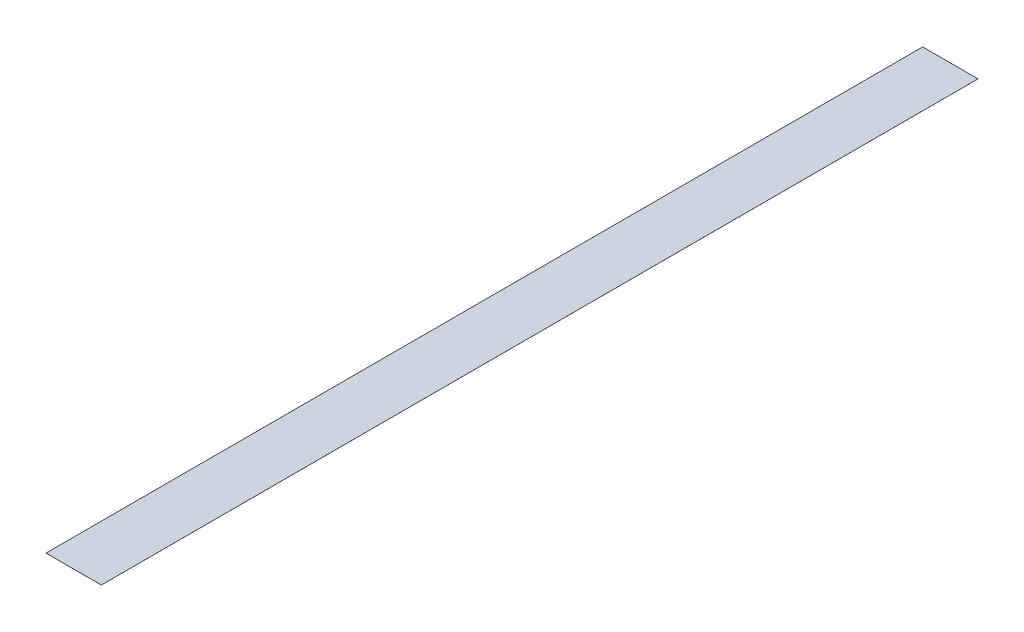
ISO-10303-21;
HEADER;
FILE_DESCRIPTION(('STEP AP214'),'2;1');
FILE_NAME('part.step','',(''),(''),'','','');
FILE_SCHEMA(('AUTOMOTIVE_DESIGN { 1 0 10303 214 1 1 1 1 }'));
ENDSEC;
DATA;
#1=APPLICATION_CONTEXT('core data for automotive mechanical design processes');
#2=APPLICATION_PROTOCOL_DEFINITION('international standard','automotive_design',2000,#1);
#3=PRODUCT_CONTEXT('',#1,'mechanical');
#4=PRODUCT('Part','Part','',(#3));
#5=PRODUCT_RELATED_PRODUCT_CATEGORY('part','',(#4));
#6=PRODUCT_DEFINITION_FORMATION('','',#4);
#7=PRODUCT_DEFINITION_CONTEXT('part definition',#1,'design');
#8=PRODUCT_DEFINITION('design','',#6,#7);
#9=PRODUCT_DEFINITION_SHAPE('','',#8);
#10=(LENGTH_UNIT() NAMED_UNIT(*) SI_UNIT(.MILLI.,.METRE.));
#11=(NAMED_UNIT(*) PLANE_ANGLE_UNIT() SI_UNIT($,.RADIAN.));
#12=(NAMED_UNIT(*) SI_UNIT($,.STERADIAN.) SOLID_ANGLE_UNIT());
#13=UNCERTAINTY_MEASURE_WITH_UNIT(LENGTH_MEASURE(1.E-05),#10,'distance_accuracy_value','');
#14=(GEOMETRIC_REPRESENTATION_CONTEXT(3) GLOBAL_UNCERTAINTY_ASSIGNED_CONTEXT((#13)) GLOBAL_UNIT_ASSIGNED_CONTEXT((#10,
#11,#12)) REPRESENTATION_CONTEXT('',''));
#15=CARTESIAN_POINT('',(0.,0.,0.));
#16=DIRECTION('',(0.,0.,1.));
#17=DIRECTION('',(1.,0.,0.));
#18=AXIS2_PLACEMENT_3D('',#15,#16,#17);
#19=CARTESIAN_POINT('',(558.780538831302,0.01,-1049.27255795052));
#20=DIRECTION('',(0.,0.,-1.));
#21=DIRECTION('',(-1.,0.,0.));
#22=AXIS2_PLACEMENT_3D('',#19,#20,#21);
#23=PLANE('',#22);
#24=DIRECTION('',(1.,0.,0.));
#25=VECTOR('',#24,1.);
#26=CARTESIAN_POINT('',(558.780538831302,0.,-1049.27255795052));
#27=LINE('',#26,#25);
#28=CARTESIAN_POINT('',(558.780538831302,0.,-1049.27255795052));
#29=VERTEX_POINT('',#28);
#30=CARTESIAN_POINT('',(577.714930074055,0.,-1049.27255795052));
#31=VERTEX_POINT('',#30);
#32=EDGE_CURVE('E110',#29,#31,#27,.T.);
#33=ORIENTED_EDGE('',*,*,#32,.F.);
#34=DIRECTION('',(0.,-1.,0.));
#35=VECTOR('',#34,1.);
#36=CARTESIAN_POINT('',(558.780538831302,0.01,-1049.27255795052));
#37=LINE('',#36,#35);
#38=CARTESIAN_POINT('',(558.780538831302,0.01,-1049.27255795052));
#39=VERTEX_POINT('',#38);
#40=EDGE_CURVE('E11',#39,#29,#37,.T.);
#41=ORIENTED_EDGE('',*,*,#40,.F.);
#42=DIRECTION('',(1.,0.,0.));
#43=VECTOR('',#42,1.);
#44=CARTESIAN_POINT('',(558.780538831302,0.01,-1049.27255795052));
#45=LINE('',#44,#43);
#46=CARTESIAN_POINT('',(577.714930074055,0.01,-1049.27255795052));
#47=VERTEX_POINT('',#46);
#48=EDGE_CURVE('E103',#39,#47,#45,.T.);
#49=ORIENTED_EDGE('',*,*,#48,.T.);
#50=DIRECTION('',(0.,-1.,0.));
#51=VECTOR('',#50,1.);
#52=CARTESIAN_POINT('',(577.714930074055,0.01,-1049.27255795052));
#53=LINE('',#52,#51);
#54=EDGE_CURVE('E42',#47,#31,#53,.T.);
#55=ORIENTED_EDGE('',*,*,#54,.T.);
#56=EDGE_LOOP('',(#33,#41,#49,#55));
#57=FACE_BOUND('',#56,.T.);
#58=ADVANCED_FACE('F39',(#57),#23,.T.);
#59=CARTESIAN_POINT('',(558.780538831302,0.01,-1049.27255795052));
#60=DIRECTION('',(1.,0.,0.));
#61=DIRECTION('',(0.,0.,-1.));
#62=AXIS2_PLACEMENT_3D('',#59,#60,#61);
#63=PLANE('',#62);
#64=DIRECTION('',(0.,0.,1.));
#65=VECTOR('',#64,1.);
#66=CARTESIAN_POINT('',(558.780538831302,0.,-1049.27255795052));
#67=LINE('',#66,#65);
#68=CARTESIAN_POINT('',(558.780538831302,0.,-749.272557950517));
#69=VERTEX_POINT('',#68);
#70=EDGE_CURVE('E73',#29,#69,#67,.T.);
#71=ORIENTED_EDGE('',*,*,#70,.T.);
#72=DIRECTION('',(0.,-1.,0.));
#73=VECTOR('',#72,1.);
#74=CARTESIAN_POINT('',(558.780538831302,0.01,-749.272557950517));
#75=LINE('',#74,#73);
#76=CARTESIAN_POINT('',(558.780538831302,0.01,-749.272557950517));
#77=VERTEX_POINT('',#76);
#78=EDGE_CURVE('E49',#77,#69,#75,.T.);
#79=ORIENTED_EDGE('',*,*,#78,.F.);
#80=DIRECTION('',(0.,0.,1.));
#81=VECTOR('',#80,1.);
#82=CARTESIAN_POINT('',(558.780538831302,0.01,-1049.27255795052));
#83=LINE('',#82,#81);
#84=EDGE_CURVE('E90',#39,#77,#83,.T.);
#85=ORIENTED_EDGE('',*,*,#84,.F.);
#86=ORIENTED_EDGE('',*,*,#40,.T.);
#87=EDGE_LOOP('',(#71,#79,#85,#86));
#88=FACE_BOUND('',#87,.T.);
#89=ADVANCED_FACE('F126',(#88),#63,.F.);
#90=CARTESIAN_POINT('',(558.780538831302,0.01,-749.272557950517));
#91=DIRECTION('',(0.,0.,-1.));
#92=DIRECTION('',(-1.,0.,0.));
#93=AXIS2_PLACEMENT_3D('',#90,#91,#92);
#94=PLANE('',#93);
#95=DIRECTION('',(1.,0.,0.));
#96=VECTOR('',#95,1.);
#97=CARTESIAN_POINT('',(558.780538831302,0.,-749.272557950517));
#98=LINE('',#97,#96);
#99=CARTESIAN_POINT('',(577.714930074055,0.,-749.272557950517));
#100=VERTEX_POINT('',#99);
#101=EDGE_CURVE('E98',#69,#100,#98,.T.);
#102=ORIENTED_EDGE('',*,*,#101,.T.);
#103=DIRECTION('',(0.,-1.,0.));
#104=VECTOR('',#103,1.);
#105=CARTESIAN_POINT('',(577.714930074055,0.01,-749.272557950517));
#106=LINE('',#105,#104);
#107=CARTESIAN_POINT('',(577.714930074055,0.01,-749.272557950517));
#108=VERTEX_POINT('',#107);
#109=EDGE_CURVE('E95',#108,#100,#106,.T.);
#110=ORIENTED_EDGE('',*,*,#109,.F.);
#111=DIRECTION('',(1.,0.,0.));
#112=VECTOR('',#111,1.);
#113=CARTESIAN_POINT('',(558.780538831302,0.01,-749.272557950517));
#114=LINE('',#113,#112);
#115=EDGE_CURVE('E85',#77,#108,#114,.T.);
#116=ORIENTED_EDGE('',*,*,#115,.F.);
#117=ORIENTED_EDGE('',*,*,#78,.T.);
#118=EDGE_LOOP('',(#102,#110,#116,#117));
#119=FACE_BOUND('',#118,.T.);
#120=ADVANCED_FACE('F96',(#119),#94,.F.);
#121=CARTESIAN_POINT('',(577.714930074055,0.01,-1049.27255795052));
#122=DIRECTION('',(1.,0.,0.));
#123=DIRECTION('',(0.,0.,-1.));
#124=AXIS2_PLACEMENT_3D('',#121,#122,#123);
#125=PLANE('',#124);
#126=DIRECTION('',(0.,0.,1.));
#127=VECTOR('',#126,1.);
#128=CARTESIAN_POINT('',(577.714930074055,0.,-1049.27255795052));
#129=LINE('',#128,#127);
#130=EDGE_CURVE('E114',#31,#100,#129,.T.);
#131=ORIENTED_EDGE('',*,*,#130,.F.);
#132=ORIENTED_EDGE('',*,*,#54,.F.);
#133=DIRECTION('',(0.,0.,1.));
#134=VECTOR('',#133,1.);
#135=CARTESIAN_POINT('',(577.714930074055,0.01,-1049.27255795052));
#136=LINE('',#135,#134);
#137=EDGE_CURVE('E89',#47,#108,#136,.T.);
#138=ORIENTED_EDGE('',*,*,#137,.T.);
#139=ORIENTED_EDGE('',*,*,#109,.T.);
#140=EDGE_LOOP('',(#131,#132,#138,#139));
#141=FACE_BOUND('',#140,.T.);
#142=ADVANCED_FACE('F101',(#141),#125,.T.);
#143=CARTESIAN_POINT('',(0.,0.01,0.));
#144=DIRECTION('',(0.,-1.,0.));
#145=DIRECTION('',(0.,0.,-1.));
#146=AXIS2_PLACEMENT_3D('',#143,#144,#145);
#147=PLANE('',#146);
#148=ORIENTED_EDGE('',*,*,#48,.F.);
#149=ORIENTED_EDGE('',*,*,#84,.T.);
#150=ORIENTED_EDGE('',*,*,#115,.T.);
#151=ORIENTED_EDGE('',*,*,#137,.F.);
#152=EDGE_LOOP('',(#148,#149,#150,#151));
#153=FACE_BOUND('',#152,.T.);
#154=ADVANCED_FACE('F88',(#153),#147,.F.);
#155=CARTESIAN_POINT('',(0.,0.,0.));
#156=DIRECTION('',(0.,-1.,0.));
#157=DIRECTION('',(0.,0.,-1.));
#158=AXIS2_PLACEMENT_3D('',#155,#156,#157);
#159=PLANE('',#158);
#160=ORIENTED_EDGE('',*,*,#32,.T.);
#161=ORIENTED_EDGE('',*,*,#130,.T.);
#162=ORIENTED_EDGE('',*,*,#101,.F.);
#163=ORIENTED_EDGE('',*,*,#70,.F.);
#164=EDGE_LOOP('',(#160,#161,#162,#163));
#165=FACE_BOUND('',#164,.T.);
#166=ADVANCED_FACE('F123',(#165),#159,.T.);
#167=CLOSED_SHELL('',(#58,#89,#120,#142,#154,#166));
#168=MANIFOLD_SOLID_BREP('B2',#167);
#169=ADVANCED_BREP_SHAPE_REPRESENTATION('',(#18,#168),#14);
#170=SHAPE_DEFINITION_REPRESENTATION(#9,#169);
ENDSEC;
END-ISO-10303-21;
